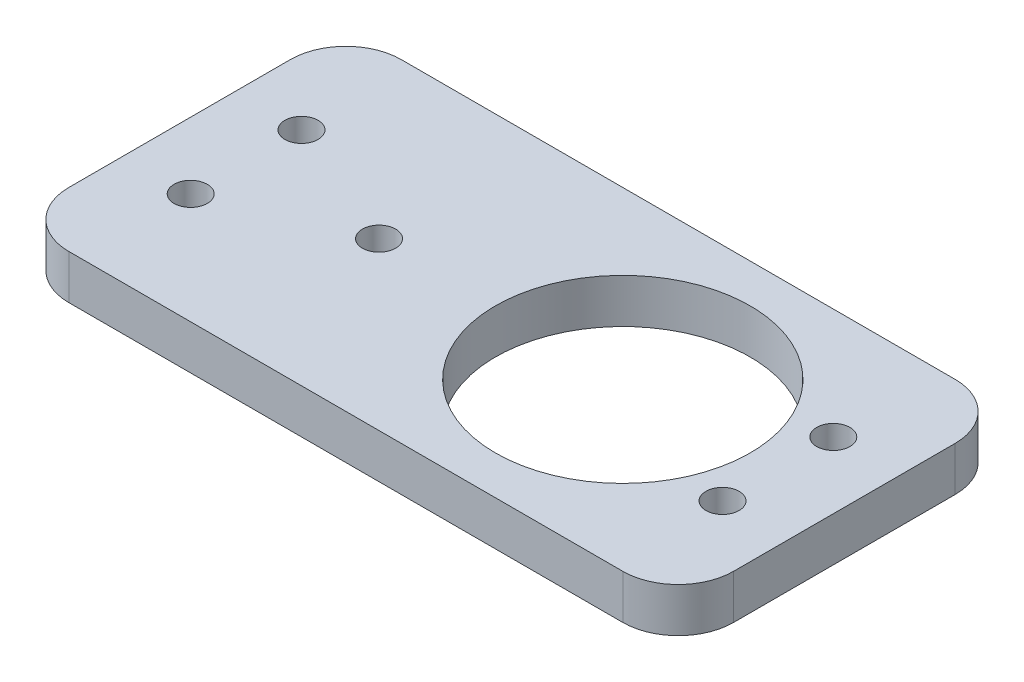
ISO-10303-21;
HEADER;
FILE_DESCRIPTION(('STEP AP214'),'2;1');
FILE_NAME('part.step','',(''),(''),'','','');
FILE_SCHEMA(('AUTOMOTIVE_DESIGN { 1 0 10303 214 1 1 1 1 }'));
ENDSEC;
DATA;
#1=APPLICATION_CONTEXT('core data for automotive mechanical design processes');
#2=APPLICATION_PROTOCOL_DEFINITION('international standard','automotive_design',2000,#1);
#3=PRODUCT_CONTEXT('',#1,'mechanical');
#4=PRODUCT('Part','Part','',(#3));
#5=PRODUCT_RELATED_PRODUCT_CATEGORY('part','',(#4));
#6=PRODUCT_DEFINITION_FORMATION('','',#4);
#7=PRODUCT_DEFINITION_CONTEXT('part definition',#1,'design');
#8=PRODUCT_DEFINITION('design','',#6,#7);
#9=PRODUCT_DEFINITION_SHAPE('','',#8);
#10=(LENGTH_UNIT() NAMED_UNIT(*) SI_UNIT(.MILLI.,.METRE.));
#11=(NAMED_UNIT(*) PLANE_ANGLE_UNIT() SI_UNIT($,.RADIAN.));
#12=(NAMED_UNIT(*) SI_UNIT($,.STERADIAN.) SOLID_ANGLE_UNIT());
#13=UNCERTAINTY_MEASURE_WITH_UNIT(LENGTH_MEASURE(1.E-05),#10,'distance_accuracy_value','');
#14=(GEOMETRIC_REPRESENTATION_CONTEXT(3) GLOBAL_UNCERTAINTY_ASSIGNED_CONTEXT((#13)) GLOBAL_UNIT_ASSIGNED_CONTEXT((#10,
#11,#12)) REPRESENTATION_CONTEXT('',''));
#15=CARTESIAN_POINT('',(0.,0.,0.));
#16=DIRECTION('',(0.,0.,1.));
#17=DIRECTION('',(1.,0.,0.));
#18=AXIS2_PLACEMENT_3D('',#15,#16,#17);
#19=CARTESIAN_POINT('',(30.,4.,15.));
#20=DIRECTION('',(-1.,0.,0.));
#21=DIRECTION('',(0.,0.,1.));
#22=AXIS2_PLACEMENT_3D('',#19,#20,#21);
#23=PLANE('',#22);
#24=DIRECTION('',(0.,0.,-1.));
#25=VECTOR('',#24,1.);
#26=CARTESIAN_POINT('',(30.,0.,15.));
#27=LINE('',#26,#25);
#28=CARTESIAN_POINT('',(30.,0.,10.));
#29=VERTEX_POINT('',#28);
#30=CARTESIAN_POINT('',(30.,0.,-10.));
#31=VERTEX_POINT('',#30);
#32=EDGE_CURVE('E159',#29,#31,#27,.T.);
#33=ORIENTED_EDGE('',*,*,#32,.T.);
#34=DIRECTION('',(0.,-1.,0.));
#35=VECTOR('',#34,1.);
#36=CARTESIAN_POINT('',(30.,4.,-10.));
#37=LINE('',#36,#35);
#38=CARTESIAN_POINT('',(30.,4.,-10.));
#39=VERTEX_POINT('',#38);
#40=EDGE_CURVE('E11',#31,#39,#37,.F.);
#41=ORIENTED_EDGE('',*,*,#40,.T.);
#42=DIRECTION('',(0.,0.,-1.));
#43=VECTOR('',#42,1.);
#44=CARTESIAN_POINT('',(30.,4.,15.));
#45=LINE('',#44,#43);
#46=CARTESIAN_POINT('',(30.,4.,10.));
#47=VERTEX_POINT('',#46);
#48=EDGE_CURVE('E127',#47,#39,#45,.T.);
#49=ORIENTED_EDGE('',*,*,#48,.F.);
#50=DIRECTION('',(0.,-1.,0.));
#51=VECTOR('',#50,1.);
#52=CARTESIAN_POINT('',(30.,4.,10.));
#53=LINE('',#52,#51);
#54=EDGE_CURVE('E43',#47,#29,#53,.T.);
#55=ORIENTED_EDGE('',*,*,#54,.T.);
#56=EDGE_LOOP('',(#33,#41,#49,#55));
#57=FACE_BOUND('',#56,.T.);
#58=ADVANCED_FACE('F35',(#57),#23,.F.);
#59=CARTESIAN_POINT('',(-30.,4.,-15.));
#60=DIRECTION('',(0.,0.,1.));
#61=DIRECTION('',(1.,0.,0.));
#62=AXIS2_PLACEMENT_3D('',#59,#60,#61);
#63=PLANE('',#62);
#64=DIRECTION('',(-1.,0.,0.));
#65=VECTOR('',#64,1.);
#66=CARTESIAN_POINT('',(-30.,0.,-15.));
#67=LINE('',#66,#65);
#68=CARTESIAN_POINT('',(25.,0.,-15.));
#69=VERTEX_POINT('',#68);
#70=CARTESIAN_POINT('',(-25.,0.,-15.));
#71=VERTEX_POINT('',#70);
#72=EDGE_CURVE('E132',#69,#71,#67,.T.);
#73=ORIENTED_EDGE('',*,*,#72,.T.);
#74=DIRECTION('',(0.,-1.,0.));
#75=VECTOR('',#74,1.);
#76=CARTESIAN_POINT('',(-25.,4.,-15.));
#77=LINE('',#76,#75);
#78=CARTESIAN_POINT('',(-25.,4.,-15.));
#79=VERTEX_POINT('',#78);
#80=EDGE_CURVE('E50',#71,#79,#77,.F.);
#81=ORIENTED_EDGE('',*,*,#80,.T.);
#82=DIRECTION('',(-1.,0.,0.));
#83=VECTOR('',#82,1.);
#84=CARTESIAN_POINT('',(-30.,4.,-15.));
#85=LINE('',#84,#83);
#86=CARTESIAN_POINT('',(25.,4.,-15.));
#87=VERTEX_POINT('',#86);
#88=EDGE_CURVE('E130',#87,#79,#85,.T.);
#89=ORIENTED_EDGE('',*,*,#88,.F.);
#90=DIRECTION('',(0.,-1.,0.));
#91=VECTOR('',#90,1.);
#92=CARTESIAN_POINT('',(25.,4.,-15.));
#93=LINE('',#92,#91);
#94=EDGE_CURVE('E151',#87,#69,#93,.T.);
#95=ORIENTED_EDGE('',*,*,#94,.T.);
#96=EDGE_LOOP('',(#73,#81,#89,#95));
#97=FACE_BOUND('',#96,.T.);
#98=ADVANCED_FACE('F237',(#97),#63,.F.);
#99=CARTESIAN_POINT('',(-30.,4.,15.));
#100=DIRECTION('',(1.,0.,0.));
#101=DIRECTION('',(0.,0.,-1.));
#102=AXIS2_PLACEMENT_3D('',#99,#100,#101);
#103=PLANE('',#102);
#104=DIRECTION('',(0.,0.,1.));
#105=VECTOR('',#104,1.);
#106=CARTESIAN_POINT('',(-30.,0.,15.));
#107=LINE('',#106,#105);
#108=CARTESIAN_POINT('',(-30.,0.,-10.));
#109=VERTEX_POINT('',#108);
#110=CARTESIAN_POINT('',(-30.,0.,10.));
#111=VERTEX_POINT('',#110);
#112=EDGE_CURVE('E128',#109,#111,#107,.T.);
#113=ORIENTED_EDGE('',*,*,#112,.T.);
#114=DIRECTION('',(0.,-1.,0.));
#115=VECTOR('',#114,1.);
#116=CARTESIAN_POINT('',(-30.,4.,10.));
#117=LINE('',#116,#115);
#118=CARTESIAN_POINT('',(-30.,4.,10.));
#119=VERTEX_POINT('',#118);
#120=EDGE_CURVE('E106',#111,#119,#117,.F.);
#121=ORIENTED_EDGE('',*,*,#120,.T.);
#122=DIRECTION('',(0.,0.,1.));
#123=VECTOR('',#122,1.);
#124=CARTESIAN_POINT('',(-30.,4.,15.));
#125=LINE('',#124,#123);
#126=CARTESIAN_POINT('',(-30.,4.,-10.));
#127=VERTEX_POINT('',#126);
#128=EDGE_CURVE('E171',#127,#119,#125,.T.);
#129=ORIENTED_EDGE('',*,*,#128,.F.);
#130=DIRECTION('',(0.,-1.,0.));
#131=VECTOR('',#130,1.);
#132=CARTESIAN_POINT('',(-30.,4.,-10.));
#133=LINE('',#132,#131);
#134=EDGE_CURVE('E111',#127,#109,#133,.T.);
#135=ORIENTED_EDGE('',*,*,#134,.T.);
#136=EDGE_LOOP('',(#113,#121,#129,#135));
#137=FACE_BOUND('',#136,.T.);
#138=ADVANCED_FACE('F234',(#137),#103,.F.);
#139=CARTESIAN_POINT('',(-30.,4.,15.));
#140=DIRECTION('',(0.,0.,-1.));
#141=DIRECTION('',(-1.,0.,0.));
#142=AXIS2_PLACEMENT_3D('',#139,#140,#141);
#143=PLANE('',#142);
#144=DIRECTION('',(1.,0.,0.));
#145=VECTOR('',#144,1.);
#146=CARTESIAN_POINT('',(-30.,4.,15.));
#147=LINE('',#146,#145);
#148=CARTESIAN_POINT('',(-25.,4.,15.));
#149=VERTEX_POINT('',#148);
#150=CARTESIAN_POINT('',(25.,4.,15.));
#151=VERTEX_POINT('',#150);
#152=EDGE_CURVE('E121',#149,#151,#147,.T.);
#153=ORIENTED_EDGE('',*,*,#152,.F.);
#154=DIRECTION('',(0.,-1.,0.));
#155=VECTOR('',#154,1.);
#156=CARTESIAN_POINT('',(-25.,4.,15.));
#157=LINE('',#156,#155);
#158=CARTESIAN_POINT('',(-25.,0.,15.));
#159=VERTEX_POINT('',#158);
#160=EDGE_CURVE('E105',#149,#159,#157,.T.);
#161=ORIENTED_EDGE('',*,*,#160,.T.);
#162=DIRECTION('',(1.,0.,0.));
#163=VECTOR('',#162,1.);
#164=CARTESIAN_POINT('',(-30.,0.,15.));
#165=LINE('',#164,#163);
#166=CARTESIAN_POINT('',(25.,0.,15.));
#167=VERTEX_POINT('',#166);
#168=EDGE_CURVE('E118',#159,#167,#165,.T.);
#169=ORIENTED_EDGE('',*,*,#168,.T.);
#170=DIRECTION('',(0.,-1.,0.));
#171=VECTOR('',#170,1.);
#172=CARTESIAN_POINT('',(25.,4.,15.));
#173=LINE('',#172,#171);
#174=EDGE_CURVE('E123',#167,#151,#173,.F.);
#175=ORIENTED_EDGE('',*,*,#174,.T.);
#176=EDGE_LOOP('',(#153,#161,#169,#175));
#177=FACE_BOUND('',#176,.T.);
#178=ADVANCED_FACE('F117',(#177),#143,.F.);
#179=CARTESIAN_POINT('',(0.,4.,0.));
#180=DIRECTION('',(0.,-1.,0.));
#181=DIRECTION('',(0.,0.,-1.));
#182=AXIS2_PLACEMENT_3D('',#179,#180,#181);
#183=PLANE('',#182);
#184=CARTESIAN_POINT('',(-12.,4.,0.));
#185=DIRECTION('',(0.,1.,0.));
#186=DIRECTION('',(0.,0.,1.));
#187=AXIS2_PLACEMENT_3D('',#184,#185,#186);
#188=CIRCLE('',#187,1.5);
#189=CARTESIAN_POINT('',(-12.,4.,1.5));
#190=VERTEX_POINT('',#189);
#191=EDGE_CURVE('E202',#190,#190,#188,.T.);
#192=ORIENTED_EDGE('',*,*,#191,.F.);
#193=EDGE_LOOP('',(#192));
#194=FACE_BOUND('',#193,.T.);
#195=CARTESIAN_POINT('',(10.,4.,0.));
#196=DIRECTION('',(0.,1.,0.));
#197=DIRECTION('',(0.,0.,1.));
#198=AXIS2_PLACEMENT_3D('',#195,#196,#197);
#199=CIRCLE('',#198,11.5);
#200=CARTESIAN_POINT('',(10.,4.,11.5));
#201=VERTEX_POINT('',#200);
#202=EDGE_CURVE('E196',#201,#201,#199,.T.);
#203=ORIENTED_EDGE('',*,*,#202,.F.);
#204=EDGE_LOOP('',(#203));
#205=FACE_BOUND('',#204,.T.);
#206=CARTESIAN_POINT('',(24.,4.,-5.));
#207=DIRECTION('',(0.,1.,0.));
#208=DIRECTION('',(0.,0.,1.));
#209=AXIS2_PLACEMENT_3D('',#206,#207,#208);
#210=CIRCLE('',#209,1.5);
#211=CARTESIAN_POINT('',(24.,4.,-3.5));
#212=VERTEX_POINT('',#211);
#213=EDGE_CURVE('E178',#212,#212,#210,.T.);
#214=ORIENTED_EDGE('',*,*,#213,.F.);
#215=EDGE_LOOP('',(#214));
#216=FACE_BOUND('',#215,.T.);
#217=CARTESIAN_POINT('',(24.,4.,5.));
#218=DIRECTION('',(0.,1.,0.));
#219=DIRECTION('',(0.,0.,1.));
#220=AXIS2_PLACEMENT_3D('',#217,#218,#219);
#221=CIRCLE('',#220,1.5);
#222=CARTESIAN_POINT('',(24.,4.,6.5));
#223=VERTEX_POINT('',#222);
#224=EDGE_CURVE('E185',#223,#223,#221,.T.);
#225=ORIENTED_EDGE('',*,*,#224,.F.);
#226=EDGE_LOOP('',(#225));
#227=FACE_BOUND('',#226,.T.);
#228=CARTESIAN_POINT('',(-24.,4.,5.));
#229=DIRECTION('',(0.,1.,0.));
#230=DIRECTION('',(0.,0.,1.));
#231=AXIS2_PLACEMENT_3D('',#228,#229,#230);
#232=CIRCLE('',#231,1.5);
#233=CARTESIAN_POINT('',(-24.,4.,6.5));
#234=VERTEX_POINT('',#233);
#235=EDGE_CURVE('E191',#234,#234,#232,.T.);
#236=ORIENTED_EDGE('',*,*,#235,.F.);
#237=EDGE_LOOP('',(#236));
#238=FACE_BOUND('',#237,.T.);
#239=CARTESIAN_POINT('',(-24.,4.,-5.));
#240=DIRECTION('',(0.,1.,0.));
#241=DIRECTION('',(0.,0.,1.));
#242=AXIS2_PLACEMENT_3D('',#239,#240,#241);
#243=CIRCLE('',#242,1.5);
#244=CARTESIAN_POINT('',(-24.,4.,-3.5));
#245=VERTEX_POINT('',#244);
#246=EDGE_CURVE('E167',#245,#245,#243,.T.);
#247=ORIENTED_EDGE('',*,*,#246,.F.);
#248=EDGE_LOOP('',(#247));
#249=FACE_BOUND('',#248,.T.);
#250=ORIENTED_EDGE('',*,*,#128,.T.);
#251=CARTESIAN_POINT('',(-25.,4.,10.));
#252=DIRECTION('',(0.,-1.,0.));
#253=DIRECTION('',(0.,0.,-1.));
#254=AXIS2_PLACEMENT_3D('',#251,#252,#253);
#255=CIRCLE('',#254,5.);
#256=EDGE_CURVE('E149',#119,#149,#255,.F.);
#257=ORIENTED_EDGE('',*,*,#256,.T.);
#258=ORIENTED_EDGE('',*,*,#152,.T.);
#259=CARTESIAN_POINT('',(25.,4.,10.));
#260=DIRECTION('',(0.,-1.,0.));
#261=DIRECTION('',(0.,0.,-1.));
#262=AXIS2_PLACEMENT_3D('',#259,#260,#261);
#263=CIRCLE('',#262,5.);
#264=EDGE_CURVE('E144',#151,#47,#263,.F.);
#265=ORIENTED_EDGE('',*,*,#264,.T.);
#266=ORIENTED_EDGE('',*,*,#48,.T.);
#267=CARTESIAN_POINT('',(25.,4.,-10.));
#268=DIRECTION('',(0.,-1.,0.));
#269=DIRECTION('',(0.,0.,-1.));
#270=AXIS2_PLACEMENT_3D('',#267,#268,#269);
#271=CIRCLE('',#270,5.);
#272=EDGE_CURVE('E57',#39,#87,#271,.F.);
#273=ORIENTED_EDGE('',*,*,#272,.T.);
#274=ORIENTED_EDGE('',*,*,#88,.T.);
#275=CARTESIAN_POINT('',(-25.,4.,-10.));
#276=DIRECTION('',(0.,-1.,0.));
#277=DIRECTION('',(0.,0.,-1.));
#278=AXIS2_PLACEMENT_3D('',#275,#276,#277);
#279=CIRCLE('',#278,5.);
#280=EDGE_CURVE('E147',#79,#127,#279,.F.);
#281=ORIENTED_EDGE('',*,*,#280,.T.);
#282=EDGE_LOOP('',(#250,#257,#258,#265,#266,#273,#274,#281));
#283=FACE_BOUND('',#282,.T.);
#284=ADVANCED_FACE('F217',(#194,#205,#216,#227,#238,#249,#283),#183,.F.);
#285=CARTESIAN_POINT('',(0.,0.,0.));
#286=DIRECTION('',(0.,-1.,0.));
#287=DIRECTION('',(0.,0.,-1.));
#288=AXIS2_PLACEMENT_3D('',#285,#286,#287);
#289=PLANE('',#288);
#290=CARTESIAN_POINT('',(-12.,0.,0.));
#291=DIRECTION('',(0.,1.,0.));
#292=DIRECTION('',(0.,0.,1.));
#293=AXIS2_PLACEMENT_3D('',#290,#291,#292);
#294=CIRCLE('',#293,1.5);
#295=CARTESIAN_POINT('',(-12.,0.,1.5));
#296=VERTEX_POINT('',#295);
#297=EDGE_CURVE('E199',#296,#296,#294,.T.);
#298=ORIENTED_EDGE('',*,*,#297,.T.);
#299=EDGE_LOOP('',(#298));
#300=FACE_BOUND('',#299,.T.);
#301=CARTESIAN_POINT('',(10.,0.,0.));
#302=DIRECTION('',(0.,1.,0.));
#303=DIRECTION('',(0.,0.,1.));
#304=AXIS2_PLACEMENT_3D('',#301,#302,#303);
#305=CIRCLE('',#304,11.5);
#306=CARTESIAN_POINT('',(10.,0.,11.5));
#307=VERTEX_POINT('',#306);
#308=EDGE_CURVE('E182',#307,#307,#305,.T.);
#309=ORIENTED_EDGE('',*,*,#308,.T.);
#310=EDGE_LOOP('',(#309));
#311=FACE_BOUND('',#310,.T.);
#312=CARTESIAN_POINT('',(24.,0.,-5.));
#313=DIRECTION('',(0.,1.,0.));
#314=DIRECTION('',(0.,0.,1.));
#315=AXIS2_PLACEMENT_3D('',#312,#313,#314);
#316=CIRCLE('',#315,1.5);
#317=CARTESIAN_POINT('',(24.,0.,-3.5));
#318=VERTEX_POINT('',#317);
#319=EDGE_CURVE('E181',#318,#318,#316,.T.);
#320=ORIENTED_EDGE('',*,*,#319,.T.);
#321=EDGE_LOOP('',(#320));
#322=FACE_BOUND('',#321,.T.);
#323=CARTESIAN_POINT('',(24.,0.,5.));
#324=DIRECTION('',(0.,1.,0.));
#325=DIRECTION('',(0.,0.,1.));
#326=AXIS2_PLACEMENT_3D('',#323,#324,#325);
#327=CIRCLE('',#326,1.5);
#328=CARTESIAN_POINT('',(24.,0.,6.5));
#329=VERTEX_POINT('',#328);
#330=EDGE_CURVE('E188',#329,#329,#327,.T.);
#331=ORIENTED_EDGE('',*,*,#330,.T.);
#332=EDGE_LOOP('',(#331));
#333=FACE_BOUND('',#332,.T.);
#334=CARTESIAN_POINT('',(-24.,0.,5.));
#335=DIRECTION('',(0.,1.,0.));
#336=DIRECTION('',(0.,0.,1.));
#337=AXIS2_PLACEMENT_3D('',#334,#335,#336);
#338=CIRCLE('',#337,1.5);
#339=CARTESIAN_POINT('',(-24.,0.,6.5));
#340=VERTEX_POINT('',#339);
#341=EDGE_CURVE('E176',#340,#340,#338,.T.);
#342=ORIENTED_EDGE('',*,*,#341,.T.);
#343=EDGE_LOOP('',(#342));
#344=FACE_BOUND('',#343,.T.);
#345=CARTESIAN_POINT('',(-24.,0.,-5.));
#346=DIRECTION('',(0.,1.,0.));
#347=DIRECTION('',(0.,0.,1.));
#348=AXIS2_PLACEMENT_3D('',#345,#346,#347);
#349=CIRCLE('',#348,1.5);
#350=CARTESIAN_POINT('',(-24.,0.,-3.5));
#351=VERTEX_POINT('',#350);
#352=EDGE_CURVE('E164',#351,#351,#349,.T.);
#353=ORIENTED_EDGE('',*,*,#352,.T.);
#354=EDGE_LOOP('',(#353));
#355=FACE_BOUND('',#354,.T.);
#356=ORIENTED_EDGE('',*,*,#168,.F.);
#357=CARTESIAN_POINT('',(-25.,0.,10.));
#358=DIRECTION('',(0.,-1.,0.));
#359=DIRECTION('',(0.,0.,-1.));
#360=AXIS2_PLACEMENT_3D('',#357,#358,#359);
#361=CIRCLE('',#360,5.);
#362=EDGE_CURVE('E101',#159,#111,#361,.T.);
#363=ORIENTED_EDGE('',*,*,#362,.T.);
#364=ORIENTED_EDGE('',*,*,#112,.F.);
#365=CARTESIAN_POINT('',(-25.,0.,-10.));
#366=DIRECTION('',(0.,-1.,0.));
#367=DIRECTION('',(0.,0.,-1.));
#368=AXIS2_PLACEMENT_3D('',#365,#366,#367);
#369=CIRCLE('',#368,5.);
#370=EDGE_CURVE('E112',#109,#71,#369,.T.);
#371=ORIENTED_EDGE('',*,*,#370,.T.);
#372=ORIENTED_EDGE('',*,*,#72,.F.);
#373=CARTESIAN_POINT('',(25.,0.,-10.));
#374=DIRECTION('',(0.,-1.,0.));
#375=DIRECTION('',(0.,0.,-1.));
#376=AXIS2_PLACEMENT_3D('',#373,#374,#375);
#377=CIRCLE('',#376,5.);
#378=EDGE_CURVE('E138',#69,#31,#377,.T.);
#379=ORIENTED_EDGE('',*,*,#378,.T.);
#380=ORIENTED_EDGE('',*,*,#32,.F.);
#381=CARTESIAN_POINT('',(25.,0.,10.));
#382=DIRECTION('',(0.,-1.,0.));
#383=DIRECTION('',(0.,0.,-1.));
#384=AXIS2_PLACEMENT_3D('',#381,#382,#383);
#385=CIRCLE('',#384,5.);
#386=EDGE_CURVE('E122',#29,#167,#385,.T.);
#387=ORIENTED_EDGE('',*,*,#386,.T.);
#388=EDGE_LOOP('',(#356,#363,#364,#371,#372,#379,#380,#387));
#389=FACE_BOUND('',#388,.T.);
#390=ADVANCED_FACE('F125',(#300,#311,#322,#333,#344,#355,#389),#289,.T.);
#391=CARTESIAN_POINT('',(-24.,0.,-5.));
#392=DIRECTION('',(0.,1.,0.));
#393=DIRECTION('',(0.,0.,1.));
#394=AXIS2_PLACEMENT_3D('',#391,#392,#393);
#395=CYLINDRICAL_SURFACE('',#394,1.5);
#396=ORIENTED_EDGE('',*,*,#352,.F.);
#397=EDGE_LOOP('',(#396));
#398=FACE_BOUND('',#397,.T.);
#399=ORIENTED_EDGE('',*,*,#246,.T.);
#400=EDGE_LOOP('',(#399));
#401=FACE_BOUND('',#400,.T.);
#402=ADVANCED_FACE('F317',(#398,#401),#395,.F.);
#403=CARTESIAN_POINT('',(-24.,0.,5.));
#404=DIRECTION('',(0.,1.,0.));
#405=DIRECTION('',(0.,0.,1.));
#406=AXIS2_PLACEMENT_3D('',#403,#404,#405);
#407=CYLINDRICAL_SURFACE('',#406,1.5);
#408=ORIENTED_EDGE('',*,*,#341,.F.);
#409=EDGE_LOOP('',(#408));
#410=FACE_BOUND('',#409,.T.);
#411=ORIENTED_EDGE('',*,*,#235,.T.);
#412=EDGE_LOOP('',(#411));
#413=FACE_BOUND('',#412,.T.);
#414=ADVANCED_FACE('F308',(#410,#413),#407,.F.);
#415=CARTESIAN_POINT('',(24.,0.,5.));
#416=DIRECTION('',(0.,1.,0.));
#417=DIRECTION('',(0.,0.,1.));
#418=AXIS2_PLACEMENT_3D('',#415,#416,#417);
#419=CYLINDRICAL_SURFACE('',#418,1.5);
#420=ORIENTED_EDGE('',*,*,#330,.F.);
#421=EDGE_LOOP('',(#420));
#422=FACE_BOUND('',#421,.T.);
#423=ORIENTED_EDGE('',*,*,#224,.T.);
#424=EDGE_LOOP('',(#423));
#425=FACE_BOUND('',#424,.T.);
#426=ADVANCED_FACE('F299',(#422,#425),#419,.F.);
#427=CARTESIAN_POINT('',(24.,0.,-5.));
#428=DIRECTION('',(0.,1.,0.));
#429=DIRECTION('',(0.,0.,1.));
#430=AXIS2_PLACEMENT_3D('',#427,#428,#429);
#431=CYLINDRICAL_SURFACE('',#430,1.5);
#432=ORIENTED_EDGE('',*,*,#319,.F.);
#433=EDGE_LOOP('',(#432));
#434=FACE_BOUND('',#433,.T.);
#435=ORIENTED_EDGE('',*,*,#213,.T.);
#436=EDGE_LOOP('',(#435));
#437=FACE_BOUND('',#436,.T.);
#438=ADVANCED_FACE('F290',(#434,#437),#431,.F.);
#439=CARTESIAN_POINT('',(10.,0.,0.));
#440=DIRECTION('',(0.,1.,0.));
#441=DIRECTION('',(0.,0.,1.));
#442=AXIS2_PLACEMENT_3D('',#439,#440,#441);
#443=CYLINDRICAL_SURFACE('',#442,11.5);
#444=ORIENTED_EDGE('',*,*,#308,.F.);
#445=EDGE_LOOP('',(#444));
#446=FACE_BOUND('',#445,.T.);
#447=ORIENTED_EDGE('',*,*,#202,.T.);
#448=EDGE_LOOP('',(#447));
#449=FACE_BOUND('',#448,.T.);
#450=ADVANCED_FACE('F213',(#446,#449),#443,.F.);
#451=CARTESIAN_POINT('',(-12.,0.,0.));
#452=DIRECTION('',(0.,1.,0.));
#453=DIRECTION('',(0.,0.,1.));
#454=AXIS2_PLACEMENT_3D('',#451,#452,#453);
#455=CYLINDRICAL_SURFACE('',#454,1.5);
#456=ORIENTED_EDGE('',*,*,#297,.F.);
#457=EDGE_LOOP('',(#456));
#458=FACE_BOUND('',#457,.T.);
#459=ORIENTED_EDGE('',*,*,#191,.T.);
#460=EDGE_LOOP('',(#459));
#461=FACE_BOUND('',#460,.T.);
#462=ADVANCED_FACE('F210',(#458,#461),#455,.F.);
#463=CARTESIAN_POINT('',(-25.,4.,10.));
#464=DIRECTION('',(0.,-1.,0.));
#465=DIRECTION('',(0.,0.,-1.));
#466=AXIS2_PLACEMENT_3D('',#463,#464,#465);
#467=CYLINDRICAL_SURFACE('',#466,5.);
#468=ORIENTED_EDGE('',*,*,#256,.F.);
#469=ORIENTED_EDGE('',*,*,#120,.F.);
#470=ORIENTED_EDGE('',*,*,#362,.F.);
#471=ORIENTED_EDGE('',*,*,#160,.F.);
#472=EDGE_LOOP('',(#468,#469,#470,#471));
#473=FACE_BOUND('',#472,.T.);
#474=ADVANCED_FACE('F104',(#473),#467,.T.);
#475=CARTESIAN_POINT('',(-25.,4.,-10.));
#476=DIRECTION('',(0.,-1.,0.));
#477=DIRECTION('',(0.,0.,-1.));
#478=AXIS2_PLACEMENT_3D('',#475,#476,#477);
#479=CYLINDRICAL_SURFACE('',#478,5.);
#480=ORIENTED_EDGE('',*,*,#280,.F.);
#481=ORIENTED_EDGE('',*,*,#80,.F.);
#482=ORIENTED_EDGE('',*,*,#370,.F.);
#483=ORIENTED_EDGE('',*,*,#134,.F.);
#484=EDGE_LOOP('',(#480,#481,#482,#483));
#485=FACE_BOUND('',#484,.T.);
#486=ADVANCED_FACE('F236',(#485),#479,.T.);
#487=CARTESIAN_POINT('',(25.,4.,-10.));
#488=DIRECTION('',(0.,-1.,0.));
#489=DIRECTION('',(0.,0.,-1.));
#490=AXIS2_PLACEMENT_3D('',#487,#488,#489);
#491=CYLINDRICAL_SURFACE('',#490,5.);
#492=ORIENTED_EDGE('',*,*,#272,.F.);
#493=ORIENTED_EDGE('',*,*,#40,.F.);
#494=ORIENTED_EDGE('',*,*,#378,.F.);
#495=ORIENTED_EDGE('',*,*,#94,.F.);
#496=EDGE_LOOP('',(#492,#493,#494,#495));
#497=FACE_BOUND('',#496,.T.);
#498=ADVANCED_FACE('F240',(#497),#491,.T.);
#499=CARTESIAN_POINT('',(25.,4.,10.));
#500=DIRECTION('',(0.,-1.,0.));
#501=DIRECTION('',(0.,0.,-1.));
#502=AXIS2_PLACEMENT_3D('',#499,#500,#501);
#503=CYLINDRICAL_SURFACE('',#502,5.);
#504=ORIENTED_EDGE('',*,*,#264,.F.);
#505=ORIENTED_EDGE('',*,*,#174,.F.);
#506=ORIENTED_EDGE('',*,*,#386,.F.);
#507=ORIENTED_EDGE('',*,*,#54,.F.);
#508=EDGE_LOOP('',(#504,#505,#506,#507));
#509=FACE_BOUND('',#508,.T.);
#510=ADVANCED_FACE('F37',(#509),#503,.T.);
#511=CLOSED_SHELL('',(#58,#98,#138,#178,#284,#390,#402,#414,#426,#438,#450,#462,#474,#486,#498,#510));
#512=MANIFOLD_SOLID_BREP('B2',#511);
#513=ADVANCED_BREP_SHAPE_REPRESENTATION('',(#18,#512),#14);
#514=SHAPE_DEFINITION_REPRESENTATION(#9,#513);
ENDSEC;
END-ISO-10303-21;
